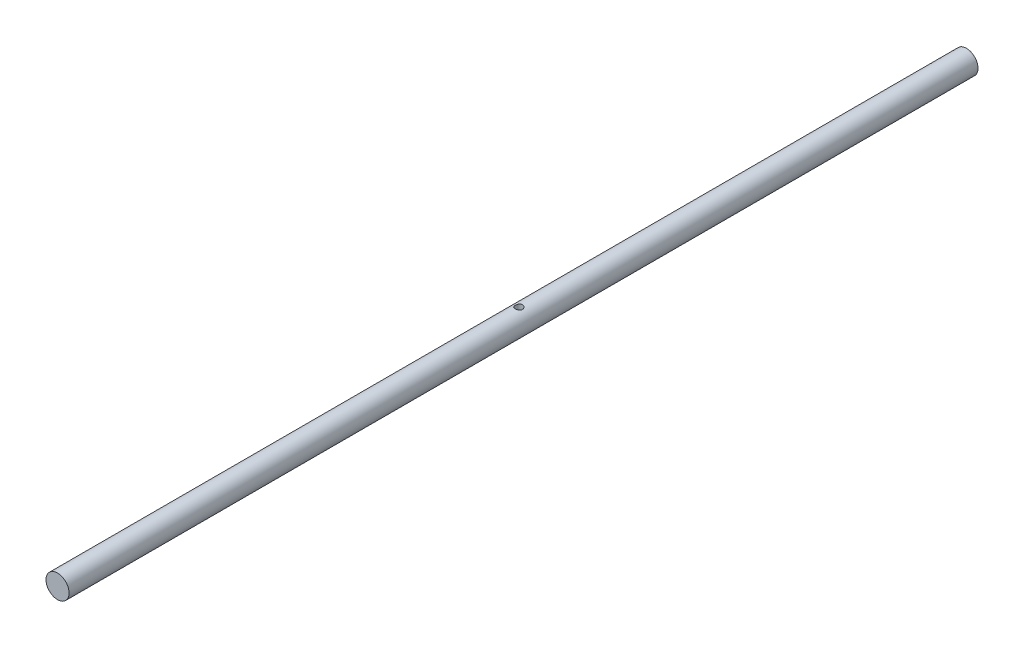
ISO-10303-21;
HEADER;
FILE_DESCRIPTION(('STEP AP214'),'2;1');
FILE_NAME('part.step','',(''),(''),'','','');
FILE_SCHEMA(('AUTOMOTIVE_DESIGN { 1 0 10303 214 1 1 1 1 }'));
ENDSEC;
DATA;
#1=APPLICATION_CONTEXT('core data for automotive mechanical design processes');
#2=APPLICATION_PROTOCOL_DEFINITION('international standard','automotive_design',2000,#1);
#3=PRODUCT_CONTEXT('',#1,'mechanical');
#4=PRODUCT('Part','Part','',(#3));
#5=PRODUCT_RELATED_PRODUCT_CATEGORY('part','',(#4));
#6=PRODUCT_DEFINITION_FORMATION('','',#4);
#7=PRODUCT_DEFINITION_CONTEXT('part definition',#1,'design');
#8=PRODUCT_DEFINITION('design','',#6,#7);
#9=PRODUCT_DEFINITION_SHAPE('','',#8);
#10=(LENGTH_UNIT() NAMED_UNIT(*) SI_UNIT(.MILLI.,.METRE.));
#11=(NAMED_UNIT(*) PLANE_ANGLE_UNIT() SI_UNIT($,.RADIAN.));
#12=(NAMED_UNIT(*) SI_UNIT($,.STERADIAN.) SOLID_ANGLE_UNIT());
#13=UNCERTAINTY_MEASURE_WITH_UNIT(LENGTH_MEASURE(1.E-05),#10,'distance_accuracy_value','');
#14=(GEOMETRIC_REPRESENTATION_CONTEXT(3) GLOBAL_UNCERTAINTY_ASSIGNED_CONTEXT((#13)) GLOBAL_UNIT_ASSIGNED_CONTEXT((#10,
#11,#12)) REPRESENTATION_CONTEXT('',''));
#15=CARTESIAN_POINT('',(0.,0.,0.));
#16=DIRECTION('',(0.,0.,1.));
#17=DIRECTION('',(1.,0.,0.));
#18=AXIS2_PLACEMENT_3D('',#15,#16,#17);
#19=CARTESIAN_POINT('',(0.,0.,1000.));
#20=DIRECTION('',(0.,0.,-1.));
#21=DIRECTION('',(-1.,0.,0.));
#22=AXIS2_PLACEMENT_3D('',#19,#20,#21);
#23=CYLINDRICAL_SURFACE('',#22,12.7);
#24=CARTESIAN_POINT('',(0.,-12.7,496.46875));
#25=CARTESIAN_POINT('',(0.217294412929184,-12.6999989166262,496.468748582084));
#26=CARTESIAN_POINT('',(0.434603691696577,-12.6943705657687,496.450845454451));
#27=CARTESIAN_POINT('',(0.862867240443322,-12.6724693873196,496.379893683113));
#28=CARTESIAN_POINT('',(1.07382006065475,-12.6561941503455,496.326837084168));
#29=CARTESIAN_POINT('',(1.48313312609131,-12.6147771484086,496.187542246454));
#30=CARTESIAN_POINT('',(1.68151231192994,-12.589649112594,496.101355368227));
#31=CARTESIAN_POINT('',(2.06100299745002,-12.5331210208647,495.898465016371));
#32=CARTESIAN_POINT('',(2.24211177003752,-12.5017199768221,495.781756734097));
#33=CARTESIAN_POINT('',(2.58751493847347,-12.4348942862539,495.517342225345));
#34=CARTESIAN_POINT('',(2.75120108939736,-12.3993819806815,495.368863689931));
#35=CARTESIAN_POINT('',(3.05180168796746,-12.3288439723816,495.046767854087));
#36=CARTESIAN_POINT('',(3.18871115145341,-12.2938183613714,494.873145883955));
#37=CARTESIAN_POINT('',(3.43517018333881,-12.2272788441653,494.500426009909));
#38=CARTESIAN_POINT('',(3.54395989676641,-12.1958731285757,494.300804508851));
#39=CARTESIAN_POINT('',(3.72617177918453,-12.141447707132,493.884959399933));
#40=CARTESIAN_POINT('',(3.79960326475997,-12.1184257926096,493.668740182856));
#41=CARTESIAN_POINT('',(3.90678860277786,-12.0842915217349,493.232700854088));
#42=CARTESIAN_POINT('',(3.94167074274712,-12.0728413904273,493.013185271442));
#43=CARTESIAN_POINT('',(3.97429212242696,-12.0621442508097,492.57114184746));
#44=CARTESIAN_POINT('',(3.97204123662538,-12.062893998283,492.34861482266));
#45=CARTESIAN_POINT('',(3.93134293525446,-12.0762137528427,491.916198588619));
#46=CARTESIAN_POINT('',(3.89432983731618,-12.0883153493259,491.706157525306));
#47=CARTESIAN_POINT('',(3.78748332400535,-12.1222143133603,491.295429902915));
#48=CARTESIAN_POINT('',(3.71764642055651,-12.144012711345,491.094744340506));
#49=CARTESIAN_POINT('',(3.54612177114172,-12.1952081477563,490.705007576452));
#50=CARTESIAN_POINT('',(3.44398363977411,-12.2247115380623,490.51616916106));
#51=CARTESIAN_POINT('',(3.21106865842371,-12.287943946336,490.157841336977));
#52=CARTESIAN_POINT('',(3.08028436905927,-12.3216740610048,489.988356971943));
#53=CARTESIAN_POINT('',(2.78675132952911,-12.3914385076889,489.665439554653));
#54=CARTESIAN_POINT('',(2.62281851163244,-12.4275078349871,489.51308840405));
#55=CARTESIAN_POINT('',(2.2712819957031,-12.4965323716104,489.237776737884));
#56=CARTESIAN_POINT('',(2.08367654558309,-12.5294873501166,489.114818399729));
#57=CARTESIAN_POINT('',(1.68803513822789,-12.5889161127653,488.901049588691));
#58=CARTESIAN_POINT('',(1.47985132946876,-12.615337375581,488.810497169902));
#59=CARTESIAN_POINT('',(1.05018832945992,-12.6583425975561,488.666019222296));
#60=CARTESIAN_POINT('',(0.828713197550652,-12.6749295435735,488.612082571893));
#61=CARTESIAN_POINT('',(0.387937874396859,-12.6959166132918,488.544210214812));
#62=CARTESIAN_POINT('',(0.168884119904586,-12.7007627269301,488.528809874091));
#63=CARTESIAN_POINT('',(-0.268701220700955,-12.6990411414587,488.534317769574));
#64=CARTESIAN_POINT('',(-0.48723287842316,-12.692475109701,488.555220701749));
#65=CARTESIAN_POINT('',(-0.911921382198319,-12.6689600496899,488.631566006525));
#66=CARTESIAN_POINT('',(-1.11825080648648,-12.6522731812643,488.68613687467));
#67=CARTESIAN_POINT('',(-1.51876737413487,-12.6104688537924,488.827205568764));
#68=CARTESIAN_POINT('',(-1.71295301442576,-12.5853503535804,488.913707337779));
#69=CARTESIAN_POINT('',(-2.08893539118419,-12.5285037326117,489.118539962542));
#70=CARTESIAN_POINT('',(-2.27031467382623,-12.4966294014609,489.237595385302));
#71=CARTESIAN_POINT('',(-2.61101157679883,-12.4299157676089,489.503286442123));
#72=CARTESIAN_POINT('',(-2.77032319328955,-12.3950756621704,489.649929556339));
#73=CARTESIAN_POINT('',(-3.0689151947679,-12.3246195875397,489.973521975915));
#74=CARTESIAN_POINT('',(-3.20715171178013,-12.2890275779295,490.151441907372));
#75=CARTESIAN_POINT('',(-3.45189969528358,-12.2225418202855,490.528727006996));
#76=CARTESIAN_POINT('',(-3.55841166565641,-12.1916479976341,490.728091834486));
#77=CARTESIAN_POINT('',(-3.73602515050723,-12.1383990890051,491.142195923864));
#78=CARTESIAN_POINT('',(-3.8072637709034,-12.1160110218308,491.356871886958));
#79=CARTESIAN_POINT('',(-3.91232689459937,-12.0824996743068,491.796015166064));
#80=CARTESIAN_POINT('',(-3.94616563489433,-12.071372107564,492.020478722391));
#81=CARTESIAN_POINT('',(-3.9744461455205,-12.0620882936656,492.461912978068));
#82=CARTESIAN_POINT('',(-3.97060037798694,-12.0633681960545,492.678763465966));
#83=CARTESIAN_POINT('',(-3.92775497559048,-12.0773853694349,493.108566807191));
#84=CARTESIAN_POINT('',(-3.88875698061477,-12.0901221059534,493.321519841865));
#85=CARTESIAN_POINT('',(-3.77786042475737,-12.1252238503226,493.734421075704));
#86=CARTESIAN_POINT('',(-3.70645189639077,-12.1474451675406,493.934514025471));
#87=CARTESIAN_POINT('',(-3.53314721788625,-12.1989756100824,494.32003831297));
#88=CARTESIAN_POINT('',(-3.43124486610453,-12.2282861769408,494.505466658599));
#89=CARTESIAN_POINT('',(-3.19518268167842,-12.2921232133137,494.864250956146));
#90=CARTESIAN_POINT('',(-3.05991683939121,-12.3268088783039,495.036850811163));
#91=CARTESIAN_POINT('',(-2.76291356358526,-12.3967557125734,495.357456591756));
#92=CARTESIAN_POINT('',(-2.60116904944347,-12.4320170335113,495.505455917547));
#93=CARTESIAN_POINT('',(-2.24944515446416,-12.500523384491,495.777497059302));
#94=CARTESIAN_POINT('',(-2.05871627399748,-12.5336649799489,495.900598788229));
#95=CARTESIAN_POINT('',(-1.65823626319337,-12.5928999251759,496.112829055568));
#96=CARTESIAN_POINT('',(-1.44849265100059,-12.6189960445273,496.2019709493));
#97=CARTESIAN_POINT('',(-1.03424874231242,-12.6593806607877,496.337277592157));
#98=CARTESIAN_POINT('',(-0.830803320332368,-12.674480645595,496.386437703694));
#99=CARTESIAN_POINT('',(-0.418242418022806,-12.6947898358104,496.452171292898));
#100=CARTESIAN_POINT('',(-0.209128093743478,-12.7000010426587,496.468751364628));
#101=CARTESIAN_POINT('',(0.,-12.7,496.46875));
#102=B_SPLINE_CURVE_WITH_KNOTS('',3,(#24,#25,#26,#27,#28,#29,#30,#31,#32,#33,#34,#35,#36,#37,
#38,#39,#40,#41,#42,#43,#44,#45,#46,#47,#48,#49,#50,#51,#52,#53,#54,#55,#56,#57,#58,#59,#60,#61,
#62,#63,#64,#65,#66,#67,#68,#69,#70,#71,#72,#73,#74,#75,#76,#77,#78,#79,#80,#81,#82,#83,#84,#85,
#86,#87,#88,#89,#90,#91,#92,#93,#94,#95,#96,#97,#98,#99,#100,#101),.UNSPECIFIED.,.T.,.F.,(4,2,2,
2,2,2,2,2,2,2,2,2,2,2,2,2,2,2,2,2,2,2,2,2,2,2,2,2,2,2,2,2,2,2,2,2,2,2,4),(0.,0.651114551948216,
1.30237650163329,1.95263287146775,2.60299175094791,3.27145085469622,3.94003426594304,
4.62514223710796,5.310069589375,5.97437051780882,6.63849479687059,7.27636712817894,
7.9143072593828,8.56156665642484,9.20899434587645,9.88589422617489,10.56284423542,
11.2450708769478,11.9270902077497,12.5827653014541,13.2383446069149,13.8776273984988,
14.516989159893,15.17193831049,15.8270653013166,16.5081514741898,17.1892268287805,
17.8676336752166,18.5457821837881,19.1932624606433,19.8407125334477,20.478683750695,
21.1167848028338,21.7798495700527,22.4430919369543,23.1279912133643,23.8126208620069,
24.4393922140371,25.0660366970775),.UNSPECIFIED.);
#103=CARTESIAN_POINT('',(0.,-12.7,496.46875));
#104=VERTEX_POINT('',#103);
#105=EDGE_CURVE('E10',#104,#104,#102,.T.);
#106=ORIENTED_EDGE('',*,*,#105,.T.);
#107=EDGE_LOOP('',(#106));
#108=FACE_BOUND('',#107,.T.);
#109=CARTESIAN_POINT('',(0.,12.7,496.46875));
#110=CARTESIAN_POINT('',(-0.217294412929184,12.6999989166262,496.468748582084));
#111=CARTESIAN_POINT('',(-0.434603691696577,12.6943705657687,496.450845454451));
#112=CARTESIAN_POINT('',(-0.862867240443322,12.6724693873196,496.379893683113));
#113=CARTESIAN_POINT('',(-1.07382006065475,12.6561941503455,496.326837084168));
#114=CARTESIAN_POINT('',(-1.48313312609131,12.6147771484086,496.187542246454));
#115=CARTESIAN_POINT('',(-1.68151231192994,12.589649112594,496.101355368227));
#116=CARTESIAN_POINT('',(-2.06100299745002,12.5331210208647,495.898465016371));
#117=CARTESIAN_POINT('',(-2.24211177003752,12.5017199768221,495.781756734097));
#118=CARTESIAN_POINT('',(-2.58751493847347,12.4348942862539,495.517342225345));
#119=CARTESIAN_POINT('',(-2.75120108939736,12.3993819806815,495.368863689931));
#120=CARTESIAN_POINT('',(-3.05180168796746,12.3288439723816,495.046767854087));
#121=CARTESIAN_POINT('',(-3.18871115145341,12.2938183613714,494.873145883955));
#122=CARTESIAN_POINT('',(-3.43517018333881,12.2272788441653,494.500426009909));
#123=CARTESIAN_POINT('',(-3.54395989676641,12.1958731285757,494.300804508851));
#124=CARTESIAN_POINT('',(-3.72617177918453,12.141447707132,493.884959399933));
#125=CARTESIAN_POINT('',(-3.79960326475997,12.1184257926096,493.668740182856));
#126=CARTESIAN_POINT('',(-3.90678860277786,12.0842915217349,493.232700854088));
#127=CARTESIAN_POINT('',(-3.94167074274712,12.0728413904273,493.013185271442));
#128=CARTESIAN_POINT('',(-3.97429212242696,12.0621442508097,492.57114184746));
#129=CARTESIAN_POINT('',(-3.97204123662538,12.062893998283,492.34861482266));
#130=CARTESIAN_POINT('',(-3.93134293525446,12.0762137528427,491.916198588619));
#131=CARTESIAN_POINT('',(-3.89432983731618,12.0883153493259,491.706157525306));
#132=CARTESIAN_POINT('',(-3.78748332400535,12.1222143133603,491.295429902915));
#133=CARTESIAN_POINT('',(-3.71764642055651,12.144012711345,491.094744340506));
#134=CARTESIAN_POINT('',(-3.54612177114172,12.1952081477563,490.705007576452));
#135=CARTESIAN_POINT('',(-3.44398363977411,12.2247115380623,490.51616916106));
#136=CARTESIAN_POINT('',(-3.21106865842371,12.287943946336,490.157841336977));
#137=CARTESIAN_POINT('',(-3.08028436905927,12.3216740610048,489.988356971943));
#138=CARTESIAN_POINT('',(-2.78675132952911,12.3914385076889,489.665439554653));
#139=CARTESIAN_POINT('',(-2.62281851163244,12.4275078349871,489.51308840405));
#140=CARTESIAN_POINT('',(-2.2712819957031,12.4965323716104,489.237776737884));
#141=CARTESIAN_POINT('',(-2.08367654558309,12.5294873501166,489.114818399729));
#142=CARTESIAN_POINT('',(-1.68803513822789,12.5889161127653,488.901049588691));
#143=CARTESIAN_POINT('',(-1.47985132946876,12.615337375581,488.810497169902));
#144=CARTESIAN_POINT('',(-1.05018832945992,12.6583425975561,488.666019222296));
#145=CARTESIAN_POINT('',(-0.828713197550652,12.6749295435735,488.612082571893));
#146=CARTESIAN_POINT('',(-0.387937874396859,12.6959166132918,488.544210214812));
#147=CARTESIAN_POINT('',(-0.168884119904586,12.7007627269301,488.528809874091));
#148=CARTESIAN_POINT('',(0.268701220700955,12.6990411414587,488.534317769574));
#149=CARTESIAN_POINT('',(0.48723287842316,12.692475109701,488.555220701749));
#150=CARTESIAN_POINT('',(0.911921382198319,12.6689600496899,488.631566006525));
#151=CARTESIAN_POINT('',(1.11825080648648,12.6522731812643,488.68613687467));
#152=CARTESIAN_POINT('',(1.51876737413487,12.6104688537924,488.827205568764));
#153=CARTESIAN_POINT('',(1.71295301442576,12.5853503535804,488.913707337779));
#154=CARTESIAN_POINT('',(2.08893539118419,12.5285037326117,489.118539962542));
#155=CARTESIAN_POINT('',(2.27031467382623,12.4966294014609,489.237595385302));
#156=CARTESIAN_POINT('',(2.61101157679883,12.4299157676089,489.503286442123));
#157=CARTESIAN_POINT('',(2.77032319328955,12.3950756621704,489.649929556339));
#158=CARTESIAN_POINT('',(3.0689151947679,12.3246195875397,489.973521975915));
#159=CARTESIAN_POINT('',(3.20715171178013,12.2890275779295,490.151441907372));
#160=CARTESIAN_POINT('',(3.45189969528358,12.2225418202855,490.528727006996));
#161=CARTESIAN_POINT('',(3.55841166565641,12.1916479976341,490.728091834486));
#162=CARTESIAN_POINT('',(3.73602515050723,12.1383990890051,491.142195923864));
#163=CARTESIAN_POINT('',(3.8072637709034,12.1160110218308,491.356871886958));
#164=CARTESIAN_POINT('',(3.91232689459937,12.0824996743068,491.796015166064));
#165=CARTESIAN_POINT('',(3.94616563489433,12.071372107564,492.020478722391));
#166=CARTESIAN_POINT('',(3.9744461455205,12.0620882936656,492.461912978068));
#167=CARTESIAN_POINT('',(3.97060037798694,12.0633681960545,492.678763465966));
#168=CARTESIAN_POINT('',(3.92775497559048,12.0773853694349,493.108566807191));
#169=CARTESIAN_POINT('',(3.88875698061477,12.0901221059534,493.321519841865));
#170=CARTESIAN_POINT('',(3.77786042475737,12.1252238503226,493.734421075704));
#171=CARTESIAN_POINT('',(3.70645189639077,12.1474451675406,493.934514025471));
#172=CARTESIAN_POINT('',(3.53314721788625,12.1989756100824,494.32003831297));
#173=CARTESIAN_POINT('',(3.43124486610453,12.2282861769408,494.505466658599));
#174=CARTESIAN_POINT('',(3.19518268167842,12.2921232133137,494.864250956146));
#175=CARTESIAN_POINT('',(3.05991683939121,12.3268088783039,495.036850811163));
#176=CARTESIAN_POINT('',(2.76291356358526,12.3967557125734,495.357456591756));
#177=CARTESIAN_POINT('',(2.60116904944347,12.4320170335113,495.505455917547));
#178=CARTESIAN_POINT('',(2.24944515446416,12.500523384491,495.777497059302));
#179=CARTESIAN_POINT('',(2.05871627399748,12.5336649799489,495.900598788229));
#180=CARTESIAN_POINT('',(1.65823626319337,12.5928999251759,496.112829055568));
#181=CARTESIAN_POINT('',(1.44849265100059,12.6189960445273,496.2019709493));
#182=CARTESIAN_POINT('',(1.03424874231242,12.6593806607877,496.337277592157));
#183=CARTESIAN_POINT('',(0.830803320332368,12.674480645595,496.386437703694));
#184=CARTESIAN_POINT('',(0.418242418022806,12.6947898358104,496.452171292898));
#185=CARTESIAN_POINT('',(0.209128093743478,12.7000010426587,496.468751364628));
#186=CARTESIAN_POINT('',(0.,12.7,496.46875));
#187=B_SPLINE_CURVE_WITH_KNOTS('',3,(#109,#110,#111,#112,#113,#114,#115,#116,#117,#118,#119,
#120,#121,#122,#123,#124,#125,#126,#127,#128,#129,#130,#131,#132,#133,#134,#135,#136,#137,#138,
#139,#140,#141,#142,#143,#144,#145,#146,#147,#148,#149,#150,#151,#152,#153,#154,#155,#156,#157,
#158,#159,#160,#161,#162,#163,#164,#165,#166,#167,#168,#169,#170,#171,#172,#173,#174,#175,#176,
#177,#178,#179,#180,#181,#182,#183,#184,#185,#186),.UNSPECIFIED.,.T.,.F.,(4,2,2,2,2,2,2,2,2,2,2,
2,2,2,2,2,2,2,2,2,2,2,2,2,2,2,2,2,2,2,2,2,2,2,2,2,2,2,4),(0.,0.651114551948216,1.30237650163329,
1.95263287146775,2.60299175094791,3.27145085469622,3.94003426594304,4.62514223710796,
5.310069589375,5.97437051780882,6.63849479687059,7.27636712817894,7.9143072593828,
8.56156665642484,9.20899434587645,9.88589422617489,10.56284423542,11.2450708769478,
11.9270902077497,12.5827653014541,13.2383446069149,13.8776273984988,14.516989159893,
15.17193831049,15.8270653013166,16.5081514741898,17.1892268287805,17.8676336752166,
18.5457821837881,19.1932624606433,19.8407125334477,20.478683750695,21.1167848028338,
21.7798495700527,22.4430919369543,23.1279912133643,23.8126208620069,24.4393922140371,
25.0660366970775),.UNSPECIFIED.);
#188=CARTESIAN_POINT('',(0.,12.7,496.46875));
#189=VERTEX_POINT('',#188);
#190=EDGE_CURVE('E57',#189,#189,#187,.T.);
#191=ORIENTED_EDGE('',*,*,#190,.T.);
#192=EDGE_LOOP('',(#191));
#193=FACE_BOUND('',#192,.T.);
#194=CARTESIAN_POINT('',(0.,0.,1000.));
#195=DIRECTION('',(0.,0.,1.));
#196=DIRECTION('',(1.,0.,0.));
#197=AXIS2_PLACEMENT_3D('',#194,#195,#196);
#198=CIRCLE('',#197,12.7);
#199=CARTESIAN_POINT('',(12.7,0.,1000.));
#200=VERTEX_POINT('',#199);
#201=EDGE_CURVE('E62',#200,#200,#198,.T.);
#202=ORIENTED_EDGE('',*,*,#201,.F.);
#203=EDGE_LOOP('',(#202));
#204=FACE_BOUND('',#203,.T.);
#205=CARTESIAN_POINT('',(0.,0.,0.));
#206=DIRECTION('',(0.,0.,1.));
#207=DIRECTION('',(1.,0.,0.));
#208=AXIS2_PLACEMENT_3D('',#205,#206,#207);
#209=CIRCLE('',#208,12.7);
#210=CARTESIAN_POINT('',(12.7,0.,0.));
#211=VERTEX_POINT('',#210);
#212=EDGE_CURVE('E67',#211,#211,#209,.T.);
#213=ORIENTED_EDGE('',*,*,#212,.T.);
#214=EDGE_LOOP('',(#213));
#215=FACE_BOUND('',#214,.T.);
#216=ADVANCED_FACE('F45',(#108,#193,#204,#215),#23,.T.);
#217=CARTESIAN_POINT('',(0.,0.,1000.));
#218=DIRECTION('',(0.,0.,1.));
#219=DIRECTION('',(1.,0.,0.));
#220=AXIS2_PLACEMENT_3D('',#217,#218,#219);
#221=PLANE('',#220);
#222=ORIENTED_EDGE('',*,*,#201,.T.);
#223=EDGE_LOOP('',(#222));
#224=FACE_BOUND('',#223,.T.);
#225=ADVANCED_FACE('F79',(#224),#221,.T.);
#226=CARTESIAN_POINT('',(0.,0.,0.));
#227=DIRECTION('',(0.,0.,1.));
#228=DIRECTION('',(1.,0.,0.));
#229=AXIS2_PLACEMENT_3D('',#226,#227,#228);
#230=PLANE('',#229);
#231=ORIENTED_EDGE('',*,*,#212,.F.);
#232=EDGE_LOOP('',(#231));
#233=FACE_BOUND('',#232,.T.);
#234=ADVANCED_FACE('F77',(#233),#230,.F.);
#235=CARTESIAN_POINT('',(0.,-12.7,492.5));
#236=DIRECTION('',(0.,1.,0.));
#237=DIRECTION('',(0.,0.,1.));
#238=AXIS2_PLACEMENT_3D('',#235,#236,#237);
#239=CYLINDRICAL_SURFACE('',#238,3.96875000000001);
#240=ORIENTED_EDGE('',*,*,#190,.F.);
#241=EDGE_LOOP('',(#240));
#242=FACE_BOUND('',#241,.T.);
#243=ORIENTED_EDGE('',*,*,#105,.F.);
#244=EDGE_LOOP('',(#243));
#245=FACE_BOUND('',#244,.T.);
#246=ADVANCED_FACE('F73',(#242,#245),#239,.F.);
#247=CLOSED_SHELL('',(#216,#225,#234,#246));
#248=MANIFOLD_SOLID_BREP('B2',#247);
#249=ADVANCED_BREP_SHAPE_REPRESENTATION('',(#18,#248),#14);
#250=SHAPE_DEFINITION_REPRESENTATION(#9,#249);
ENDSEC;
END-ISO-10303-21;
